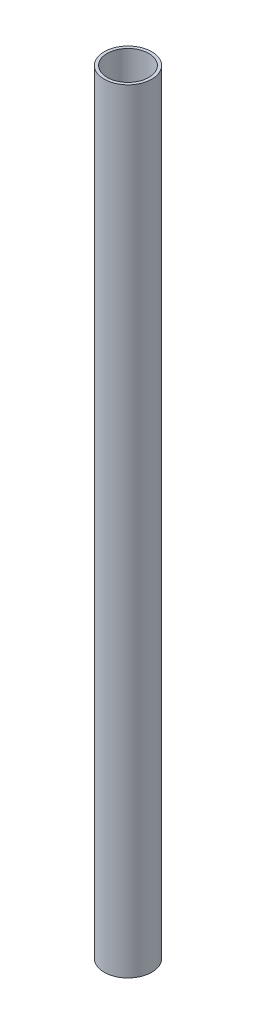
ISO-10303-21;
HEADER;
FILE_DESCRIPTION(('STEP AP214'),'2;1');
FILE_NAME('part.step','',(''),(''),'','','');
FILE_SCHEMA(('AUTOMOTIVE_DESIGN { 1 0 10303 214 1 1 1 1 }'));
ENDSEC;
DATA;
#1=APPLICATION_CONTEXT('core data for automotive mechanical design processes');
#2=APPLICATION_PROTOCOL_DEFINITION('international standard','automotive_design',2000,#1);
#3=PRODUCT_CONTEXT('',#1,'mechanical');
#4=PRODUCT('Part','Part','',(#3));
#5=PRODUCT_RELATED_PRODUCT_CATEGORY('part','',(#4));
#6=PRODUCT_DEFINITION_FORMATION('','',#4);
#7=PRODUCT_DEFINITION_CONTEXT('part definition',#1,'design');
#8=PRODUCT_DEFINITION('design','',#6,#7);
#9=PRODUCT_DEFINITION_SHAPE('','',#8);
#10=(LENGTH_UNIT() NAMED_UNIT(*) SI_UNIT(.MILLI.,.METRE.));
#11=(NAMED_UNIT(*) PLANE_ANGLE_UNIT() SI_UNIT($,.RADIAN.));
#12=(NAMED_UNIT(*) SI_UNIT($,.STERADIAN.) SOLID_ANGLE_UNIT());
#13=UNCERTAINTY_MEASURE_WITH_UNIT(LENGTH_MEASURE(1.E-05),#10,'distance_accuracy_value','');
#14=(GEOMETRIC_REPRESENTATION_CONTEXT(3) GLOBAL_UNCERTAINTY_ASSIGNED_CONTEXT((#13)) GLOBAL_UNIT_ASSIGNED_CONTEXT((#10,
#11,#12)) REPRESENTATION_CONTEXT('',''));
#15=CARTESIAN_POINT('',(0.,0.,0.));
#16=DIRECTION('',(0.,0.,1.));
#17=DIRECTION('',(1.,0.,0.));
#18=AXIS2_PLACEMENT_3D('',#15,#16,#17);
#19=CARTESIAN_POINT('',(0.,650.,0.));
#20=DIRECTION('',(0.,1.,0.));
#21=DIRECTION('',(0.,0.,1.));
#22=AXIS2_PLACEMENT_3D('',#19,#20,#21);
#23=PLANE('',#22);
#24=CARTESIAN_POINT('',(0.,650.,0.));
#25=DIRECTION('',(0.,1.,0.));
#26=DIRECTION('',(0.,0.,1.));
#27=AXIS2_PLACEMENT_3D('',#24,#25,#26);
#28=CIRCLE('',#27,20.);
#29=CARTESIAN_POINT('',(0.,650.,20.));
#30=VERTEX_POINT('',#29);
#31=EDGE_CURVE('E10',#30,#30,#28,.T.);
#32=ORIENTED_EDGE('',*,*,#31,.T.);
#33=EDGE_LOOP('',(#32));
#34=FACE_BOUND('',#33,.T.);
#35=CARTESIAN_POINT('',(0.,650.,0.));
#36=DIRECTION('',(0.,1.,0.));
#37=DIRECTION('',(0.,0.,1.));
#38=AXIS2_PLACEMENT_3D('',#35,#36,#37);
#39=CIRCLE('',#38,17.5);
#40=CARTESIAN_POINT('',(0.,650.,17.5));
#41=VERTEX_POINT('',#40);
#42=EDGE_CURVE('E50',#41,#41,#39,.T.);
#43=ORIENTED_EDGE('',*,*,#42,.F.);
#44=EDGE_LOOP('',(#43));
#45=FACE_BOUND('',#44,.T.);
#46=ADVANCED_FACE('F37',(#34,#45),#23,.T.);
#47=CARTESIAN_POINT('',(0.,0.,0.));
#48=DIRECTION('',(0.,1.,0.));
#49=DIRECTION('',(0.,0.,1.));
#50=AXIS2_PLACEMENT_3D('',#47,#48,#49);
#51=PLANE('',#50);
#52=CARTESIAN_POINT('',(0.,0.,0.));
#53=DIRECTION('',(0.,1.,0.));
#54=DIRECTION('',(0.,0.,1.));
#55=AXIS2_PLACEMENT_3D('',#52,#53,#54);
#56=CIRCLE('',#55,20.);
#57=CARTESIAN_POINT('',(0.,0.,20.));
#58=VERTEX_POINT('',#57);
#59=EDGE_CURVE('E41',#58,#58,#56,.T.);
#60=ORIENTED_EDGE('',*,*,#59,.F.);
#61=EDGE_LOOP('',(#60));
#62=FACE_BOUND('',#61,.T.);
#63=CARTESIAN_POINT('',(0.,0.,0.));
#64=DIRECTION('',(0.,1.,0.));
#65=DIRECTION('',(0.,0.,1.));
#66=AXIS2_PLACEMENT_3D('',#63,#64,#65);
#67=CIRCLE('',#66,17.5);
#68=CARTESIAN_POINT('',(0.,0.,17.5));
#69=VERTEX_POINT('',#68);
#70=EDGE_CURVE('E52',#69,#69,#67,.T.);
#71=ORIENTED_EDGE('',*,*,#70,.T.);
#72=EDGE_LOOP('',(#71));
#73=FACE_BOUND('',#72,.T.);
#74=ADVANCED_FACE('F64',(#62,#73),#51,.F.);
#75=CARTESIAN_POINT('',(0.,650.,0.));
#76=DIRECTION('',(0.,-1.,0.));
#77=DIRECTION('',(0.,0.,-1.));
#78=AXIS2_PLACEMENT_3D('',#75,#76,#77);
#79=CYLINDRICAL_SURFACE('',#78,20.);
#80=ORIENTED_EDGE('',*,*,#31,.F.);
#81=EDGE_LOOP('',(#80));
#82=FACE_BOUND('',#81,.T.);
#83=ORIENTED_EDGE('',*,*,#59,.T.);
#84=EDGE_LOOP('',(#83));
#85=FACE_BOUND('',#84,.T.);
#86=ADVANCED_FACE('F39',(#82,#85),#79,.T.);
#87=CARTESIAN_POINT('',(0.,650.,0.));
#88=DIRECTION('',(0.,-1.,0.));
#89=DIRECTION('',(0.,0.,-1.));
#90=AXIS2_PLACEMENT_3D('',#87,#88,#89);
#91=CYLINDRICAL_SURFACE('',#90,17.5);
#92=ORIENTED_EDGE('',*,*,#42,.T.);
#93=EDGE_LOOP('',(#92));
#94=FACE_BOUND('',#93,.T.);
#95=ORIENTED_EDGE('',*,*,#70,.F.);
#96=EDGE_LOOP('',(#95));
#97=FACE_BOUND('',#96,.T.);
#98=ADVANCED_FACE('F60',(#94,#97),#91,.F.);
#99=CLOSED_SHELL('',(#46,#74,#86,#98));
#100=MANIFOLD_SOLID_BREP('B2',#99);
#101=ADVANCED_BREP_SHAPE_REPRESENTATION('',(#18,#100),#14);
#102=SHAPE_DEFINITION_REPRESENTATION(#9,#101);
ENDSEC;
END-ISO-10303-21;
